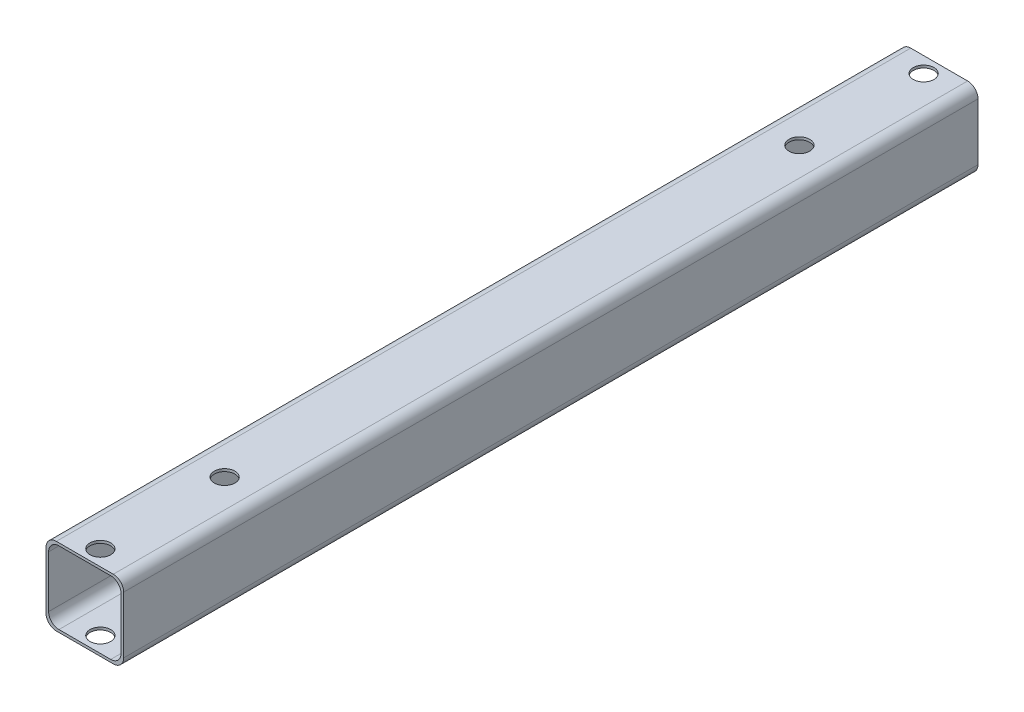
ISO-10303-21;
HEADER;
FILE_DESCRIPTION(('STEP AP214'),'2;1');
FILE_NAME('part.step','',(''),(''),'','','');
FILE_SCHEMA(('AUTOMOTIVE_DESIGN { 1 0 10303 214 1 1 1 1 }'));
ENDSEC;
DATA;
#1=APPLICATION_CONTEXT('core data for automotive mechanical design processes');
#2=APPLICATION_PROTOCOL_DEFINITION('international standard','automotive_design',2000,#1);
#3=PRODUCT_CONTEXT('',#1,'mechanical');
#4=PRODUCT('Part','Part','',(#3));
#5=PRODUCT_RELATED_PRODUCT_CATEGORY('part','',(#4));
#6=PRODUCT_DEFINITION_FORMATION('','',#4);
#7=PRODUCT_DEFINITION_CONTEXT('part definition',#1,'design');
#8=PRODUCT_DEFINITION('design','',#6,#7);
#9=PRODUCT_DEFINITION_SHAPE('','',#8);
#10=(LENGTH_UNIT() NAMED_UNIT(*) SI_UNIT(.MILLI.,.METRE.));
#11=(NAMED_UNIT(*) PLANE_ANGLE_UNIT() SI_UNIT($,.RADIAN.));
#12=(NAMED_UNIT(*) SI_UNIT($,.STERADIAN.) SOLID_ANGLE_UNIT());
#13=UNCERTAINTY_MEASURE_WITH_UNIT(LENGTH_MEASURE(1.E-05),#10,'distance_accuracy_value','');
#14=(GEOMETRIC_REPRESENTATION_CONTEXT(3) GLOBAL_UNCERTAINTY_ASSIGNED_CONTEXT((#13)) GLOBAL_UNIT_ASSIGNED_CONTEXT((#10,
#11,#12)) REPRESENTATION_CONTEXT('',''));
#15=CARTESIAN_POINT('',(0.,0.,0.));
#16=DIRECTION('',(0.,0.,1.));
#17=DIRECTION('',(1.,0.,0.));
#18=AXIS2_PLACEMENT_3D('',#15,#16,#17);
#19=CARTESIAN_POINT('',(0.,0.,165.));
#20=DIRECTION('',(0.,0.,1.));
#21=DIRECTION('',(1.,0.,0.));
#22=AXIS2_PLACEMENT_3D('',#19,#20,#21);
#23=PLANE('',#22);
#24=DIRECTION('',(0.,-1.,0.));
#25=VECTOR('',#24,1.);
#26=CARTESIAN_POINT('',(-7.5,-7.5,165.));
#27=LINE('',#26,#25);
#28=CARTESIAN_POINT('',(-7.5,5.5,165.));
#29=VERTEX_POINT('',#28);
#30=CARTESIAN_POINT('',(-7.5,-5.5,165.));
#31=VERTEX_POINT('',#30);
#32=EDGE_CURVE('E306',#29,#31,#27,.T.);
#33=ORIENTED_EDGE('',*,*,#32,.T.);
#34=CARTESIAN_POINT('',(-5.5,-5.5,165.));
#35=DIRECTION('',(0.,0.,1.));
#36=DIRECTION('',(1.,0.,0.));
#37=AXIS2_PLACEMENT_3D('',#34,#35,#36);
#38=CIRCLE('',#37,2.);
#39=CARTESIAN_POINT('',(-5.5,-7.5,165.));
#40=VERTEX_POINT('',#39);
#41=EDGE_CURVE('E11',#31,#40,#38,.T.);
#42=ORIENTED_EDGE('',*,*,#41,.T.);
#43=DIRECTION('',(1.,0.,0.));
#44=VECTOR('',#43,1.);
#45=CARTESIAN_POINT('',(7.5,-7.5,165.));
#46=LINE('',#45,#44);
#47=CARTESIAN_POINT('',(5.5,-7.5,165.));
#48=VERTEX_POINT('',#47);
#49=EDGE_CURVE('E309',#40,#48,#46,.T.);
#50=ORIENTED_EDGE('',*,*,#49,.T.);
#51=CARTESIAN_POINT('',(5.5,-5.5,165.));
#52=DIRECTION('',(0.,0.,1.));
#53=DIRECTION('',(1.,0.,0.));
#54=AXIS2_PLACEMENT_3D('',#51,#52,#53);
#55=CIRCLE('',#54,2.);
#56=CARTESIAN_POINT('',(7.5,-5.5,165.));
#57=VERTEX_POINT('',#56);
#58=EDGE_CURVE('E46',#48,#57,#55,.T.);
#59=ORIENTED_EDGE('',*,*,#58,.T.);
#60=DIRECTION('',(0.,1.,0.));
#61=VECTOR('',#60,1.);
#62=CARTESIAN_POINT('',(7.5,-7.5,165.));
#63=LINE('',#62,#61);
#64=CARTESIAN_POINT('',(7.5,5.5,165.));
#65=VERTEX_POINT('',#64);
#66=EDGE_CURVE('E183',#57,#65,#63,.T.);
#67=ORIENTED_EDGE('',*,*,#66,.T.);
#68=CARTESIAN_POINT('',(5.5,5.5,165.));
#69=DIRECTION('',(0.,0.,1.));
#70=DIRECTION('',(1.,0.,0.));
#71=AXIS2_PLACEMENT_3D('',#68,#69,#70);
#72=CIRCLE('',#71,2.);
#73=CARTESIAN_POINT('',(5.5,7.5,165.));
#74=VERTEX_POINT('',#73);
#75=EDGE_CURVE('E61',#65,#74,#72,.T.);
#76=ORIENTED_EDGE('',*,*,#75,.T.);
#77=DIRECTION('',(-1.,0.,0.));
#78=VECTOR('',#77,1.);
#79=CARTESIAN_POINT('',(7.5,7.5,165.));
#80=LINE('',#79,#78);
#81=CARTESIAN_POINT('',(-5.5,7.5,165.));
#82=VERTEX_POINT('',#81);
#83=EDGE_CURVE('E179',#74,#82,#80,.T.);
#84=ORIENTED_EDGE('',*,*,#83,.T.);
#85=CARTESIAN_POINT('',(-5.5,5.5,165.));
#86=DIRECTION('',(0.,0.,1.));
#87=DIRECTION('',(1.,0.,0.));
#88=AXIS2_PLACEMENT_3D('',#85,#86,#87);
#89=CIRCLE('',#88,2.);
#90=EDGE_CURVE('E241',#82,#29,#89,.T.);
#91=ORIENTED_EDGE('',*,*,#90,.T.);
#92=EDGE_LOOP('',(#33,#42,#50,#59,#67,#76,#84,#91));
#93=FACE_BOUND('',#92,.T.);
#94=DIRECTION('',(1.,0.,0.));
#95=VECTOR('',#94,1.);
#96=CARTESIAN_POINT('',(7.,-7.,165.));
#97=LINE('',#96,#95);
#98=CARTESIAN_POINT('',(-5.,-7.,165.));
#99=VERTEX_POINT('',#98);
#100=CARTESIAN_POINT('',(5.,-7.,165.));
#101=VERTEX_POINT('',#100);
#102=EDGE_CURVE('E292',#99,#101,#97,.T.);
#103=ORIENTED_EDGE('',*,*,#102,.F.);
#104=CARTESIAN_POINT('',(-5.,-5.,165.));
#105=DIRECTION('',(0.,0.,1.));
#106=DIRECTION('',(1.,0.,0.));
#107=AXIS2_PLACEMENT_3D('',#104,#105,#106);
#108=CIRCLE('',#107,2.);
#109=CARTESIAN_POINT('',(-7.,-5.,165.));
#110=VERTEX_POINT('',#109);
#111=EDGE_CURVE('E164',#99,#110,#108,.F.);
#112=ORIENTED_EDGE('',*,*,#111,.T.);
#113=DIRECTION('',(0.,-1.,0.));
#114=VECTOR('',#113,1.);
#115=CARTESIAN_POINT('',(-7.,-7.,165.));
#116=LINE('',#115,#114);
#117=CARTESIAN_POINT('',(-7.,5.,165.));
#118=VERTEX_POINT('',#117);
#119=EDGE_CURVE('E289',#118,#110,#116,.T.);
#120=ORIENTED_EDGE('',*,*,#119,.F.);
#121=CARTESIAN_POINT('',(-5.,5.,165.));
#122=DIRECTION('',(0.,0.,1.));
#123=DIRECTION('',(1.,0.,0.));
#124=AXIS2_PLACEMENT_3D('',#121,#122,#123);
#125=CIRCLE('',#124,2.);
#126=CARTESIAN_POINT('',(-5.,7.,165.));
#127=VERTEX_POINT('',#126);
#128=EDGE_CURVE('E231',#118,#127,#125,.F.);
#129=ORIENTED_EDGE('',*,*,#128,.T.);
#130=DIRECTION('',(-1.,0.,0.));
#131=VECTOR('',#130,1.);
#132=CARTESIAN_POINT('',(7.,7.,165.));
#133=LINE('',#132,#131);
#134=CARTESIAN_POINT('',(5.,7.,165.));
#135=VERTEX_POINT('',#134);
#136=EDGE_CURVE('E298',#135,#127,#133,.T.);
#137=ORIENTED_EDGE('',*,*,#136,.F.);
#138=CARTESIAN_POINT('',(5.,5.,165.));
#139=DIRECTION('',(0.,0.,1.));
#140=DIRECTION('',(1.,0.,0.));
#141=AXIS2_PLACEMENT_3D('',#138,#139,#140);
#142=CIRCLE('',#141,2.);
#143=CARTESIAN_POINT('',(7.,5.,165.));
#144=VERTEX_POINT('',#143);
#145=EDGE_CURVE('E165',#135,#144,#142,.F.);
#146=ORIENTED_EDGE('',*,*,#145,.T.);
#147=DIRECTION('',(0.,1.,0.));
#148=VECTOR('',#147,1.);
#149=CARTESIAN_POINT('',(7.,-7.,165.));
#150=LINE('',#149,#148);
#151=CARTESIAN_POINT('',(7.,-5.,165.));
#152=VERTEX_POINT('',#151);
#153=EDGE_CURVE('E295',#152,#144,#150,.T.);
#154=ORIENTED_EDGE('',*,*,#153,.F.);
#155=CARTESIAN_POINT('',(5.,-5.,165.));
#156=DIRECTION('',(0.,0.,1.));
#157=DIRECTION('',(1.,0.,0.));
#158=AXIS2_PLACEMENT_3D('',#155,#156,#157);
#159=CIRCLE('',#158,2.);
#160=EDGE_CURVE('E223',#152,#101,#159,.F.);
#161=ORIENTED_EDGE('',*,*,#160,.T.);
#162=EDGE_LOOP('',(#103,#112,#120,#129,#137,#146,#154,#161));
#163=FACE_BOUND('',#162,.T.);
#164=ADVANCED_FACE('F37',(#93,#163),#23,.T.);
#165=CARTESIAN_POINT('',(0.,0.,0.));
#166=DIRECTION('',(0.,0.,1.));
#167=DIRECTION('',(1.,0.,0.));
#168=AXIS2_PLACEMENT_3D('',#165,#166,#167);
#169=PLANE('',#168);
#170=DIRECTION('',(1.,0.,0.));
#171=VECTOR('',#170,1.);
#172=CARTESIAN_POINT('',(7.5,-7.5,0.));
#173=LINE('',#172,#171);
#174=CARTESIAN_POINT('',(-5.5,-7.5,0.));
#175=VERTEX_POINT('',#174);
#176=CARTESIAN_POINT('',(5.5,-7.5,0.));
#177=VERTEX_POINT('',#176);
#178=EDGE_CURVE('E315',#175,#177,#173,.T.);
#179=ORIENTED_EDGE('',*,*,#178,.F.);
#180=CARTESIAN_POINT('',(-5.5,-5.5,0.));
#181=DIRECTION('',(0.,0.,1.));
#182=DIRECTION('',(1.,0.,0.));
#183=AXIS2_PLACEMENT_3D('',#180,#181,#182);
#184=CIRCLE('',#183,2.);
#185=CARTESIAN_POINT('',(-7.5,-5.5,0.));
#186=VERTEX_POINT('',#185);
#187=EDGE_CURVE('E239',#175,#186,#184,.F.);
#188=ORIENTED_EDGE('',*,*,#187,.T.);
#189=DIRECTION('',(0.,-1.,0.));
#190=VECTOR('',#189,1.);
#191=CARTESIAN_POINT('',(-7.5,-7.5,0.));
#192=LINE('',#191,#190);
#193=CARTESIAN_POINT('',(-7.5,5.5,0.));
#194=VERTEX_POINT('',#193);
#195=EDGE_CURVE('E301',#194,#186,#192,.T.);
#196=ORIENTED_EDGE('',*,*,#195,.F.);
#197=CARTESIAN_POINT('',(-5.5,5.5,0.));
#198=DIRECTION('',(0.,0.,1.));
#199=DIRECTION('',(1.,0.,0.));
#200=AXIS2_PLACEMENT_3D('',#197,#198,#199);
#201=CIRCLE('',#200,2.);
#202=CARTESIAN_POINT('',(-5.5,7.5,0.));
#203=VERTEX_POINT('',#202);
#204=EDGE_CURVE('E233',#194,#203,#201,.F.);
#205=ORIENTED_EDGE('',*,*,#204,.T.);
#206=DIRECTION('',(-1.,0.,0.));
#207=VECTOR('',#206,1.);
#208=CARTESIAN_POINT('',(7.5,7.5,0.));
#209=LINE('',#208,#207);
#210=CARTESIAN_POINT('',(5.5,7.5,0.));
#211=VERTEX_POINT('',#210);
#212=EDGE_CURVE('E186',#211,#203,#209,.T.);
#213=ORIENTED_EDGE('',*,*,#212,.F.);
#214=CARTESIAN_POINT('',(5.5,5.5,0.));
#215=DIRECTION('',(0.,0.,1.));
#216=DIRECTION('',(1.,0.,0.));
#217=AXIS2_PLACEMENT_3D('',#214,#215,#216);
#218=CIRCLE('',#217,2.);
#219=CARTESIAN_POINT('',(7.5,5.5,0.));
#220=VERTEX_POINT('',#219);
#221=EDGE_CURVE('E235',#211,#220,#218,.F.);
#222=ORIENTED_EDGE('',*,*,#221,.T.);
#223=DIRECTION('',(0.,1.,0.));
#224=VECTOR('',#223,1.);
#225=CARTESIAN_POINT('',(7.5,-7.5,0.));
#226=LINE('',#225,#224);
#227=CARTESIAN_POINT('',(7.5,-5.5,0.));
#228=VERTEX_POINT('',#227);
#229=EDGE_CURVE('E317',#228,#220,#226,.T.);
#230=ORIENTED_EDGE('',*,*,#229,.F.);
#231=CARTESIAN_POINT('',(5.5,-5.5,0.));
#232=DIRECTION('',(0.,0.,1.));
#233=DIRECTION('',(1.,0.,0.));
#234=AXIS2_PLACEMENT_3D('',#231,#232,#233);
#235=CIRCLE('',#234,2.);
#236=EDGE_CURVE('E237',#228,#177,#235,.F.);
#237=ORIENTED_EDGE('',*,*,#236,.T.);
#238=EDGE_LOOP('',(#179,#188,#196,#205,#213,#222,#230,#237));
#239=FACE_BOUND('',#238,.T.);
#240=DIRECTION('',(-1.,0.,0.));
#241=VECTOR('',#240,1.);
#242=CARTESIAN_POINT('',(7.,7.,0.));
#243=LINE('',#242,#241);
#244=CARTESIAN_POINT('',(5.,7.,0.));
#245=VERTEX_POINT('',#244);
#246=CARTESIAN_POINT('',(-5.,7.,0.));
#247=VERTEX_POINT('',#246);
#248=EDGE_CURVE('E293',#245,#247,#243,.T.);
#249=ORIENTED_EDGE('',*,*,#248,.T.);
#250=CARTESIAN_POINT('',(-5.,5.,0.));
#251=DIRECTION('',(0.,0.,1.));
#252=DIRECTION('',(1.,0.,0.));
#253=AXIS2_PLACEMENT_3D('',#250,#251,#252);
#254=CIRCLE('',#253,2.);
#255=CARTESIAN_POINT('',(-7.,5.,0.));
#256=VERTEX_POINT('',#255);
#257=EDGE_CURVE('E229',#247,#256,#254,.T.);
#258=ORIENTED_EDGE('',*,*,#257,.T.);
#259=DIRECTION('',(0.,-1.,0.));
#260=VECTOR('',#259,1.);
#261=CARTESIAN_POINT('',(-7.,-7.,0.));
#262=LINE('',#261,#260);
#263=CARTESIAN_POINT('',(-7.,-5.,0.));
#264=VERTEX_POINT('',#263);
#265=EDGE_CURVE('E159',#256,#264,#262,.T.);
#266=ORIENTED_EDGE('',*,*,#265,.T.);
#267=CARTESIAN_POINT('',(-5.,-5.,0.));
#268=DIRECTION('',(0.,0.,1.));
#269=DIRECTION('',(1.,0.,0.));
#270=AXIS2_PLACEMENT_3D('',#267,#268,#269);
#271=CIRCLE('',#270,2.);
#272=CARTESIAN_POINT('',(-5.,-7.,0.));
#273=VERTEX_POINT('',#272);
#274=EDGE_CURVE('E153',#264,#273,#271,.T.);
#275=ORIENTED_EDGE('',*,*,#274,.T.);
#276=DIRECTION('',(1.,0.,0.));
#277=VECTOR('',#276,1.);
#278=CARTESIAN_POINT('',(7.,-7.,0.));
#279=LINE('',#278,#277);
#280=CARTESIAN_POINT('',(5.,-7.,0.));
#281=VERTEX_POINT('',#280);
#282=EDGE_CURVE('E157',#273,#281,#279,.T.);
#283=ORIENTED_EDGE('',*,*,#282,.T.);
#284=CARTESIAN_POINT('',(5.,-5.,0.));
#285=DIRECTION('',(0.,0.,1.));
#286=DIRECTION('',(1.,0.,0.));
#287=AXIS2_PLACEMENT_3D('',#284,#285,#286);
#288=CIRCLE('',#287,2.);
#289=CARTESIAN_POINT('',(7.,-5.,0.));
#290=VERTEX_POINT('',#289);
#291=EDGE_CURVE('E221',#281,#290,#288,.T.);
#292=ORIENTED_EDGE('',*,*,#291,.T.);
#293=DIRECTION('',(0.,1.,0.));
#294=VECTOR('',#293,1.);
#295=CARTESIAN_POINT('',(7.,-7.,0.));
#296=LINE('',#295,#294);
#297=CARTESIAN_POINT('',(7.,5.,0.));
#298=VERTEX_POINT('',#297);
#299=EDGE_CURVE('E175',#290,#298,#296,.T.);
#300=ORIENTED_EDGE('',*,*,#299,.T.);
#301=CARTESIAN_POINT('',(5.,5.,0.));
#302=DIRECTION('',(0.,0.,1.));
#303=DIRECTION('',(1.,0.,0.));
#304=AXIS2_PLACEMENT_3D('',#301,#302,#303);
#305=CIRCLE('',#304,2.);
#306=EDGE_CURVE('E225',#298,#245,#305,.T.);
#307=ORIENTED_EDGE('',*,*,#306,.T.);
#308=EDGE_LOOP('',(#249,#258,#266,#275,#283,#292,#300,#307));
#309=FACE_BOUND('',#308,.T.);
#310=ADVANCED_FACE('F156',(#239,#309),#169,.F.);
#311=CARTESIAN_POINT('',(-7.5,-7.5,165.));
#312=DIRECTION('',(1.,0.,0.));
#313=DIRECTION('',(0.,0.,-1.));
#314=AXIS2_PLACEMENT_3D('',#311,#312,#313);
#315=PLANE('',#314);
#316=ORIENTED_EDGE('',*,*,#195,.T.);
#317=DIRECTION('',(0.,0.,-1.));
#318=VECTOR('',#317,1.);
#319=CARTESIAN_POINT('',(-7.5,-5.5,165.));
#320=LINE('',#319,#318);
#321=EDGE_CURVE('E210',#186,#31,#320,.F.);
#322=ORIENTED_EDGE('',*,*,#321,.T.);
#323=ORIENTED_EDGE('',*,*,#32,.F.);
#324=DIRECTION('',(0.,0.,-1.));
#325=VECTOR('',#324,1.);
#326=CARTESIAN_POINT('',(-7.5,5.5,165.));
#327=LINE('',#326,#325);
#328=EDGE_CURVE('E207',#29,#194,#327,.T.);
#329=ORIENTED_EDGE('',*,*,#328,.T.);
#330=EDGE_LOOP('',(#316,#322,#323,#329));
#331=FACE_BOUND('',#330,.T.);
#332=ADVANCED_FACE('F333',(#331),#315,.F.);
#333=CARTESIAN_POINT('',(7.5,-7.5,165.));
#334=DIRECTION('',(0.,1.,0.));
#335=DIRECTION('',(-1.,0.,0.));
#336=AXIS2_PLACEMENT_3D('',#333,#334,#335);
#337=PLANE('',#336);
#338=CARTESIAN_POINT('',(0.,-7.5,3.));
#339=DIRECTION('',(0.,-1.,0.));
#340=DIRECTION('',(1.,0.,0.));
#341=AXIS2_PLACEMENT_3D('',#338,#339,#340);
#342=CIRCLE('',#341,2.);
#343=CARTESIAN_POINT('',(2.,-7.5,3.));
#344=VERTEX_POINT('',#343);
#345=EDGE_CURVE('E604',#344,#344,#342,.T.);
#346=ORIENTED_EDGE('',*,*,#345,.F.);
#347=EDGE_LOOP('',(#346));
#348=FACE_BOUND('',#347,.T.);
#349=CARTESIAN_POINT('',(0.,-7.5,27.));
#350=DIRECTION('',(0.,-1.,0.));
#351=DIRECTION('',(1.,0.,0.));
#352=AXIS2_PLACEMENT_3D('',#349,#350,#351);
#353=CIRCLE('',#352,2.);
#354=CARTESIAN_POINT('',(2.,-7.5,27.));
#355=VERTEX_POINT('',#354);
#356=EDGE_CURVE('E257',#355,#355,#353,.T.);
#357=ORIENTED_EDGE('',*,*,#356,.F.);
#358=EDGE_LOOP('',(#357));
#359=FACE_BOUND('',#358,.T.);
#360=CARTESIAN_POINT('',(0.,-7.5,138.));
#361=DIRECTION('',(0.,-1.,0.));
#362=DIRECTION('',(1.,0.,0.));
#363=AXIS2_PLACEMENT_3D('',#360,#361,#362);
#364=CIRCLE('',#363,2.);
#365=CARTESIAN_POINT('',(2.,-7.5,138.));
#366=VERTEX_POINT('',#365);
#367=EDGE_CURVE('E253',#366,#366,#364,.T.);
#368=ORIENTED_EDGE('',*,*,#367,.F.);
#369=EDGE_LOOP('',(#368));
#370=FACE_BOUND('',#369,.T.);
#371=CARTESIAN_POINT('',(0.,-7.5,162.));
#372=DIRECTION('',(0.,-1.,0.));
#373=DIRECTION('',(1.,0.,0.));
#374=AXIS2_PLACEMENT_3D('',#371,#372,#373);
#375=CIRCLE('',#374,2.);
#376=CARTESIAN_POINT('',(2.,-7.5,162.));
#377=VERTEX_POINT('',#376);
#378=EDGE_CURVE('E249',#377,#377,#375,.T.);
#379=ORIENTED_EDGE('',*,*,#378,.F.);
#380=EDGE_LOOP('',(#379));
#381=FACE_BOUND('',#380,.T.);
#382=ORIENTED_EDGE('',*,*,#49,.F.);
#383=DIRECTION('',(0.,0.,-1.));
#384=VECTOR('',#383,1.);
#385=CARTESIAN_POINT('',(-5.5,-7.5,165.));
#386=LINE('',#385,#384);
#387=EDGE_CURVE('E204',#40,#175,#386,.T.);
#388=ORIENTED_EDGE('',*,*,#387,.T.);
#389=ORIENTED_EDGE('',*,*,#178,.T.);
#390=DIRECTION('',(0.,0.,-1.));
#391=VECTOR('',#390,1.);
#392=CARTESIAN_POINT('',(5.5,-7.5,165.));
#393=LINE('',#392,#391);
#394=EDGE_CURVE('E202',#177,#48,#393,.F.);
#395=ORIENTED_EDGE('',*,*,#394,.T.);
#396=EDGE_LOOP('',(#382,#388,#389,#395));
#397=FACE_BOUND('',#396,.T.);
#398=ADVANCED_FACE('F342',(#348,#359,#370,#381,#397),#337,.F.);
#399=CARTESIAN_POINT('',(7.5,-7.5,165.));
#400=DIRECTION('',(-1.,0.,0.));
#401=DIRECTION('',(0.,0.,1.));
#402=AXIS2_PLACEMENT_3D('',#399,#400,#401);
#403=PLANE('',#402);
#404=ORIENTED_EDGE('',*,*,#66,.F.);
#405=DIRECTION('',(0.,0.,-1.));
#406=VECTOR('',#405,1.);
#407=CARTESIAN_POINT('',(7.5,-5.5,165.));
#408=LINE('',#407,#406);
#409=EDGE_CURVE('E214',#57,#228,#408,.T.);
#410=ORIENTED_EDGE('',*,*,#409,.T.);
#411=ORIENTED_EDGE('',*,*,#229,.T.);
#412=DIRECTION('',(0.,0.,-1.));
#413=VECTOR('',#412,1.);
#414=CARTESIAN_POINT('',(7.5,5.5,165.));
#415=LINE('',#414,#413);
#416=EDGE_CURVE('E212',#220,#65,#415,.F.);
#417=ORIENTED_EDGE('',*,*,#416,.T.);
#418=EDGE_LOOP('',(#404,#410,#411,#417));
#419=FACE_BOUND('',#418,.T.);
#420=ADVANCED_FACE('F349',(#419),#403,.F.);
#421=CARTESIAN_POINT('',(7.5,7.5,165.));
#422=DIRECTION('',(0.,-1.,0.));
#423=DIRECTION('',(1.,0.,0.));
#424=AXIS2_PLACEMENT_3D('',#421,#422,#423);
#425=PLANE('',#424);
#426=CARTESIAN_POINT('',(0.,7.5,3.));
#427=DIRECTION('',(0.,-1.,0.));
#428=DIRECTION('',(1.,0.,0.));
#429=AXIS2_PLACEMENT_3D('',#426,#427,#428);
#430=CIRCLE('',#429,2.);
#431=CARTESIAN_POINT('',(2.,7.5,3.));
#432=VERTEX_POINT('',#431);
#433=EDGE_CURVE('E264',#432,#432,#430,.T.);
#434=ORIENTED_EDGE('',*,*,#433,.T.);
#435=EDGE_LOOP('',(#434));
#436=FACE_BOUND('',#435,.T.);
#437=CARTESIAN_POINT('',(0.,7.5,27.));
#438=DIRECTION('',(0.,-1.,0.));
#439=DIRECTION('',(1.,0.,0.));
#440=AXIS2_PLACEMENT_3D('',#437,#438,#439);
#441=CIRCLE('',#440,2.);
#442=CARTESIAN_POINT('',(2.,7.5,27.));
#443=VERTEX_POINT('',#442);
#444=EDGE_CURVE('E261',#443,#443,#441,.T.);
#445=ORIENTED_EDGE('',*,*,#444,.T.);
#446=EDGE_LOOP('',(#445));
#447=FACE_BOUND('',#446,.T.);
#448=CARTESIAN_POINT('',(0.,7.5,138.));
#449=DIRECTION('',(0.,-1.,0.));
#450=DIRECTION('',(1.,0.,0.));
#451=AXIS2_PLACEMENT_3D('',#448,#449,#450);
#452=CIRCLE('',#451,2.);
#453=CARTESIAN_POINT('',(2.,7.5,138.));
#454=VERTEX_POINT('',#453);
#455=EDGE_CURVE('E279',#454,#454,#452,.T.);
#456=ORIENTED_EDGE('',*,*,#455,.T.);
#457=EDGE_LOOP('',(#456));
#458=FACE_BOUND('',#457,.T.);
#459=CARTESIAN_POINT('',(0.,7.5,162.));
#460=DIRECTION('',(0.,-1.,0.));
#461=DIRECTION('',(1.,0.,0.));
#462=AXIS2_PLACEMENT_3D('',#459,#460,#461);
#463=CIRCLE('',#462,2.);
#464=CARTESIAN_POINT('',(2.,7.5,162.));
#465=VERTEX_POINT('',#464);
#466=EDGE_CURVE('E286',#465,#465,#463,.T.);
#467=ORIENTED_EDGE('',*,*,#466,.T.);
#468=EDGE_LOOP('',(#467));
#469=FACE_BOUND('',#468,.T.);
#470=ORIENTED_EDGE('',*,*,#83,.F.);
#471=DIRECTION('',(0.,0.,-1.));
#472=VECTOR('',#471,1.);
#473=CARTESIAN_POINT('',(5.5,7.5,165.));
#474=LINE('',#473,#472);
#475=EDGE_CURVE('E218',#74,#211,#474,.T.);
#476=ORIENTED_EDGE('',*,*,#475,.T.);
#477=ORIENTED_EDGE('',*,*,#212,.T.);
#478=DIRECTION('',(0.,0.,-1.));
#479=VECTOR('',#478,1.);
#480=CARTESIAN_POINT('',(-5.5,7.5,165.));
#481=LINE('',#480,#479);
#482=EDGE_CURVE('E54',#203,#82,#481,.F.);
#483=ORIENTED_EDGE('',*,*,#482,.T.);
#484=EDGE_LOOP('',(#470,#476,#477,#483));
#485=FACE_BOUND('',#484,.T.);
#486=ADVANCED_FACE('F323',(#436,#447,#458,#469,#485),#425,.F.);
#487=CARTESIAN_POINT('',(-7.,-7.,165.));
#488=DIRECTION('',(1.,0.,0.));
#489=DIRECTION('',(0.,0.,-1.));
#490=AXIS2_PLACEMENT_3D('',#487,#488,#489);
#491=PLANE('',#490);
#492=ORIENTED_EDGE('',*,*,#119,.T.);
#493=DIRECTION('',(0.,0.,-1.));
#494=VECTOR('',#493,1.);
#495=CARTESIAN_POINT('',(-7.,-5.,0.));
#496=LINE('',#495,#494);
#497=EDGE_CURVE('E200',#110,#264,#496,.T.);
#498=ORIENTED_EDGE('',*,*,#497,.T.);
#499=ORIENTED_EDGE('',*,*,#265,.F.);
#500=DIRECTION('',(0.,0.,-1.));
#501=VECTOR('',#500,1.);
#502=CARTESIAN_POINT('',(-7.,5.,165.));
#503=LINE('',#502,#501);
#504=EDGE_CURVE('E198',#256,#118,#503,.F.);
#505=ORIENTED_EDGE('',*,*,#504,.T.);
#506=EDGE_LOOP('',(#492,#498,#499,#505));
#507=FACE_BOUND('',#506,.T.);
#508=ADVANCED_FACE('F364',(#507),#491,.T.);
#509=CARTESIAN_POINT('',(7.,-7.,165.));
#510=DIRECTION('',(0.,1.,0.));
#511=DIRECTION('',(-1.,0.,0.));
#512=AXIS2_PLACEMENT_3D('',#509,#510,#511);
#513=PLANE('',#512);
#514=CARTESIAN_POINT('',(0.,-7.,3.));
#515=DIRECTION('',(0.,1.,0.));
#516=DIRECTION('',(-1.,0.,0.));
#517=AXIS2_PLACEMENT_3D('',#514,#515,#516);
#518=CIRCLE('',#517,2.);
#519=CARTESIAN_POINT('',(-2.,-7.,3.));
#520=VERTEX_POINT('',#519);
#521=EDGE_CURVE('E269',#520,#520,#518,.T.);
#522=ORIENTED_EDGE('',*,*,#521,.F.);
#523=EDGE_LOOP('',(#522));
#524=FACE_BOUND('',#523,.T.);
#525=CARTESIAN_POINT('',(0.,-7.,27.));
#526=DIRECTION('',(0.,1.,0.));
#527=DIRECTION('',(-1.,0.,0.));
#528=AXIS2_PLACEMENT_3D('',#525,#526,#527);
#529=CIRCLE('',#528,2.);
#530=CARTESIAN_POINT('',(-2.,-7.,27.));
#531=VERTEX_POINT('',#530);
#532=EDGE_CURVE('E256',#531,#531,#529,.T.);
#533=ORIENTED_EDGE('',*,*,#532,.F.);
#534=EDGE_LOOP('',(#533));
#535=FACE_BOUND('',#534,.T.);
#536=CARTESIAN_POINT('',(0.,-7.,138.));
#537=DIRECTION('',(0.,1.,0.));
#538=DIRECTION('',(-1.,0.,0.));
#539=AXIS2_PLACEMENT_3D('',#536,#537,#538);
#540=CIRCLE('',#539,2.);
#541=CARTESIAN_POINT('',(-2.,-7.,138.));
#542=VERTEX_POINT('',#541);
#543=EDGE_CURVE('E252',#542,#542,#540,.T.);
#544=ORIENTED_EDGE('',*,*,#543,.F.);
#545=EDGE_LOOP('',(#544));
#546=FACE_BOUND('',#545,.T.);
#547=CARTESIAN_POINT('',(0.,-7.,162.));
#548=DIRECTION('',(0.,1.,0.));
#549=DIRECTION('',(-1.,0.,0.));
#550=AXIS2_PLACEMENT_3D('',#547,#548,#549);
#551=CIRCLE('',#550,2.);
#552=CARTESIAN_POINT('',(-2.,-7.,162.));
#553=VERTEX_POINT('',#552);
#554=EDGE_CURVE('E248',#553,#553,#551,.T.);
#555=ORIENTED_EDGE('',*,*,#554,.F.);
#556=EDGE_LOOP('',(#555));
#557=FACE_BOUND('',#556,.T.);
#558=ORIENTED_EDGE('',*,*,#102,.T.);
#559=DIRECTION('',(0.,0.,-1.));
#560=VECTOR('',#559,1.);
#561=CARTESIAN_POINT('',(5.,-7.,0.));
#562=LINE('',#561,#560);
#563=EDGE_CURVE('E174',#101,#281,#562,.T.);
#564=ORIENTED_EDGE('',*,*,#563,.T.);
#565=ORIENTED_EDGE('',*,*,#282,.F.);
#566=DIRECTION('',(0.,0.,-1.));
#567=VECTOR('',#566,1.);
#568=CARTESIAN_POINT('',(-5.,-7.,165.));
#569=LINE('',#568,#567);
#570=EDGE_CURVE('E171',#273,#99,#569,.F.);
#571=ORIENTED_EDGE('',*,*,#570,.T.);
#572=EDGE_LOOP('',(#558,#564,#565,#571));
#573=FACE_BOUND('',#572,.T.);
#574=ADVANCED_FACE('F170',(#524,#535,#546,#557,#573),#513,.T.);
#575=CARTESIAN_POINT('',(7.,-7.,165.));
#576=DIRECTION('',(-1.,0.,0.));
#577=DIRECTION('',(0.,0.,1.));
#578=AXIS2_PLACEMENT_3D('',#575,#576,#577);
#579=PLANE('',#578);
#580=ORIENTED_EDGE('',*,*,#299,.F.);
#581=DIRECTION('',(0.,0.,-1.));
#582=VECTOR('',#581,1.);
#583=CARTESIAN_POINT('',(7.,-5.,165.));
#584=LINE('',#583,#582);
#585=EDGE_CURVE('E191',#290,#152,#584,.F.);
#586=ORIENTED_EDGE('',*,*,#585,.T.);
#587=ORIENTED_EDGE('',*,*,#153,.T.);
#588=DIRECTION('',(0.,0.,-1.));
#589=VECTOR('',#588,1.);
#590=CARTESIAN_POINT('',(7.,5.,0.));
#591=LINE('',#590,#589);
#592=EDGE_CURVE('E181',#144,#298,#591,.T.);
#593=ORIENTED_EDGE('',*,*,#592,.T.);
#594=EDGE_LOOP('',(#580,#586,#587,#593));
#595=FACE_BOUND('',#594,.T.);
#596=ADVANCED_FACE('F411',(#595),#579,.T.);
#597=CARTESIAN_POINT('',(7.,7.,165.));
#598=DIRECTION('',(0.,-1.,0.));
#599=DIRECTION('',(1.,0.,0.));
#600=AXIS2_PLACEMENT_3D('',#597,#598,#599);
#601=PLANE('',#600);
#602=CARTESIAN_POINT('',(0.,7.,3.));
#603=DIRECTION('',(0.,-1.,0.));
#604=DIRECTION('',(1.,0.,0.));
#605=AXIS2_PLACEMENT_3D('',#602,#603,#604);
#606=CIRCLE('',#605,2.);
#607=CARTESIAN_POINT('',(2.,7.,3.));
#608=VERTEX_POINT('',#607);
#609=EDGE_CURVE('E41',#608,#608,#606,.T.);
#610=ORIENTED_EDGE('',*,*,#609,.F.);
#611=EDGE_LOOP('',(#610));
#612=FACE_BOUND('',#611,.T.);
#613=CARTESIAN_POINT('',(0.,7.,27.));
#614=DIRECTION('',(0.,-1.,0.));
#615=DIRECTION('',(1.,0.,0.));
#616=AXIS2_PLACEMENT_3D('',#613,#614,#615);
#617=CIRCLE('',#616,2.);
#618=CARTESIAN_POINT('',(2.,7.,27.));
#619=VERTEX_POINT('',#618);
#620=EDGE_CURVE('E254',#619,#619,#617,.T.);
#621=ORIENTED_EDGE('',*,*,#620,.F.);
#622=EDGE_LOOP('',(#621));
#623=FACE_BOUND('',#622,.T.);
#624=CARTESIAN_POINT('',(0.,7.,138.));
#625=DIRECTION('',(0.,-1.,0.));
#626=DIRECTION('',(1.,0.,0.));
#627=AXIS2_PLACEMENT_3D('',#624,#625,#626);
#628=CIRCLE('',#627,2.);
#629=CARTESIAN_POINT('',(2.,7.,138.));
#630=VERTEX_POINT('',#629);
#631=EDGE_CURVE('E250',#630,#630,#628,.T.);
#632=ORIENTED_EDGE('',*,*,#631,.F.);
#633=EDGE_LOOP('',(#632));
#634=FACE_BOUND('',#633,.T.);
#635=CARTESIAN_POINT('',(0.,7.,162.));
#636=DIRECTION('',(0.,-1.,0.));
#637=DIRECTION('',(1.,0.,0.));
#638=AXIS2_PLACEMENT_3D('',#635,#636,#637);
#639=CIRCLE('',#638,2.);
#640=CARTESIAN_POINT('',(2.,7.,162.));
#641=VERTEX_POINT('',#640);
#642=EDGE_CURVE('E245',#641,#641,#639,.T.);
#643=ORIENTED_EDGE('',*,*,#642,.F.);
#644=EDGE_LOOP('',(#643));
#645=FACE_BOUND('',#644,.T.);
#646=ORIENTED_EDGE('',*,*,#248,.F.);
#647=DIRECTION('',(0.,0.,-1.));
#648=VECTOR('',#647,1.);
#649=CARTESIAN_POINT('',(5.,7.,165.));
#650=LINE('',#649,#648);
#651=EDGE_CURVE('E196',#245,#135,#650,.F.);
#652=ORIENTED_EDGE('',*,*,#651,.T.);
#653=ORIENTED_EDGE('',*,*,#136,.T.);
#654=DIRECTION('',(0.,0.,-1.));
#655=VECTOR('',#654,1.);
#656=CARTESIAN_POINT('',(-5.,7.,0.));
#657=LINE('',#656,#655);
#658=EDGE_CURVE('E193',#127,#247,#657,.T.);
#659=ORIENTED_EDGE('',*,*,#658,.T.);
#660=EDGE_LOOP('',(#646,#652,#653,#659));
#661=FACE_BOUND('',#660,.T.);
#662=ADVANCED_FACE('F375',(#612,#623,#634,#645,#661),#601,.T.);
#663=CARTESIAN_POINT('',(5.,-5.,165.));
#664=DIRECTION('',(0.,0.,1.));
#665=DIRECTION('',(1.,0.,0.));
#666=AXIS2_PLACEMENT_3D('',#663,#664,#665);
#667=CYLINDRICAL_SURFACE('',#666,2.);
#668=ORIENTED_EDGE('',*,*,#160,.F.);
#669=ORIENTED_EDGE('',*,*,#585,.F.);
#670=ORIENTED_EDGE('',*,*,#291,.F.);
#671=ORIENTED_EDGE('',*,*,#563,.F.);
#672=EDGE_LOOP('',(#668,#669,#670,#671));
#673=FACE_BOUND('',#672,.T.);
#674=ADVANCED_FACE('F371',(#673),#667,.F.);
#675=CARTESIAN_POINT('',(5.,5.,165.));
#676=DIRECTION('',(0.,0.,1.));
#677=DIRECTION('',(1.,0.,0.));
#678=AXIS2_PLACEMENT_3D('',#675,#676,#677);
#679=CYLINDRICAL_SURFACE('',#678,2.);
#680=ORIENTED_EDGE('',*,*,#145,.F.);
#681=ORIENTED_EDGE('',*,*,#651,.F.);
#682=ORIENTED_EDGE('',*,*,#306,.F.);
#683=ORIENTED_EDGE('',*,*,#592,.F.);
#684=EDGE_LOOP('',(#680,#681,#682,#683));
#685=FACE_BOUND('',#684,.T.);
#686=ADVANCED_FACE('F374',(#685),#679,.F.);
#687=CARTESIAN_POINT('',(-5.,-5.,165.));
#688=DIRECTION('',(0.,0.,1.));
#689=DIRECTION('',(1.,0.,0.));
#690=AXIS2_PLACEMENT_3D('',#687,#688,#689);
#691=CYLINDRICAL_SURFACE('',#690,2.);
#692=ORIENTED_EDGE('',*,*,#111,.F.);
#693=ORIENTED_EDGE('',*,*,#570,.F.);
#694=ORIENTED_EDGE('',*,*,#274,.F.);
#695=ORIENTED_EDGE('',*,*,#497,.F.);
#696=EDGE_LOOP('',(#692,#693,#694,#695));
#697=FACE_BOUND('',#696,.T.);
#698=ADVANCED_FACE('F178',(#697),#691,.F.);
#699=CARTESIAN_POINT('',(-5.,5.,165.));
#700=DIRECTION('',(0.,0.,1.));
#701=DIRECTION('',(1.,0.,0.));
#702=AXIS2_PLACEMENT_3D('',#699,#700,#701);
#703=CYLINDRICAL_SURFACE('',#702,2.);
#704=ORIENTED_EDGE('',*,*,#128,.F.);
#705=ORIENTED_EDGE('',*,*,#504,.F.);
#706=ORIENTED_EDGE('',*,*,#257,.F.);
#707=ORIENTED_EDGE('',*,*,#658,.F.);
#708=EDGE_LOOP('',(#704,#705,#706,#707));
#709=FACE_BOUND('',#708,.T.);
#710=ADVANCED_FACE('F382',(#709),#703,.F.);
#711=CARTESIAN_POINT('',(-5.5,-5.5,165.));
#712=DIRECTION('',(0.,0.,-1.));
#713=DIRECTION('',(-1.,0.,0.));
#714=AXIS2_PLACEMENT_3D('',#711,#712,#713);
#715=CYLINDRICAL_SURFACE('',#714,2.);
#716=ORIENTED_EDGE('',*,*,#41,.F.);
#717=ORIENTED_EDGE('',*,*,#321,.F.);
#718=ORIENTED_EDGE('',*,*,#187,.F.);
#719=ORIENTED_EDGE('',*,*,#387,.F.);
#720=EDGE_LOOP('',(#716,#717,#718,#719));
#721=FACE_BOUND('',#720,.T.);
#722=ADVANCED_FACE('F337',(#721),#715,.T.);
#723=CARTESIAN_POINT('',(5.5,-5.5,165.));
#724=DIRECTION('',(0.,0.,-1.));
#725=DIRECTION('',(-1.,0.,0.));
#726=AXIS2_PLACEMENT_3D('',#723,#724,#725);
#727=CYLINDRICAL_SURFACE('',#726,2.);
#728=ORIENTED_EDGE('',*,*,#58,.F.);
#729=ORIENTED_EDGE('',*,*,#394,.F.);
#730=ORIENTED_EDGE('',*,*,#236,.F.);
#731=ORIENTED_EDGE('',*,*,#409,.F.);
#732=EDGE_LOOP('',(#728,#729,#730,#731));
#733=FACE_BOUND('',#732,.T.);
#734=ADVANCED_FACE('F346',(#733),#727,.T.);
#735=CARTESIAN_POINT('',(5.5,5.5,165.));
#736=DIRECTION('',(0.,0.,-1.));
#737=DIRECTION('',(-1.,0.,0.));
#738=AXIS2_PLACEMENT_3D('',#735,#736,#737);
#739=CYLINDRICAL_SURFACE('',#738,2.);
#740=ORIENTED_EDGE('',*,*,#75,.F.);
#741=ORIENTED_EDGE('',*,*,#416,.F.);
#742=ORIENTED_EDGE('',*,*,#221,.F.);
#743=ORIENTED_EDGE('',*,*,#475,.F.);
#744=EDGE_LOOP('',(#740,#741,#742,#743));
#745=FACE_BOUND('',#744,.T.);
#746=ADVANCED_FACE('F351',(#745),#739,.T.);
#747=CARTESIAN_POINT('',(-5.5,5.5,165.));
#748=DIRECTION('',(0.,0.,-1.));
#749=DIRECTION('',(-1.,0.,0.));
#750=AXIS2_PLACEMENT_3D('',#747,#748,#749);
#751=CYLINDRICAL_SURFACE('',#750,2.);
#752=ORIENTED_EDGE('',*,*,#90,.F.);
#753=ORIENTED_EDGE('',*,*,#482,.F.);
#754=ORIENTED_EDGE('',*,*,#204,.F.);
#755=ORIENTED_EDGE('',*,*,#328,.F.);
#756=EDGE_LOOP('',(#752,#753,#754,#755));
#757=FACE_BOUND('',#756,.T.);
#758=ADVANCED_FACE('F39',(#757),#751,.T.);
#759=CARTESIAN_POINT('',(0.,20.5,162.));
#760=DIRECTION('',(0.,-1.,0.));
#761=DIRECTION('',(1.,0.,0.));
#762=AXIS2_PLACEMENT_3D('',#759,#760,#761);
#763=CYLINDRICAL_SURFACE('',#762,2.);
#764=ORIENTED_EDGE('',*,*,#642,.T.);
#765=EDGE_LOOP('',(#764));
#766=FACE_BOUND('',#765,.T.);
#767=ORIENTED_EDGE('',*,*,#466,.F.);
#768=EDGE_LOOP('',(#767));
#769=FACE_BOUND('',#768,.T.);
#770=ADVANCED_FACE('F393',(#766,#769),#763,.F.);
#771=ORIENTED_EDGE('',*,*,#554,.T.);
#772=EDGE_LOOP('',(#771));
#773=FACE_BOUND('',#772,.T.);
#774=ORIENTED_EDGE('',*,*,#378,.T.);
#775=EDGE_LOOP('',(#774));
#776=FACE_BOUND('',#775,.T.);
#777=ADVANCED_FACE('F397',(#773,#776),#763,.F.);
#778=CARTESIAN_POINT('',(0.,20.5,138.));
#779=DIRECTION('',(0.,-1.,0.));
#780=DIRECTION('',(1.,0.,0.));
#781=AXIS2_PLACEMENT_3D('',#778,#779,#780);
#782=CYLINDRICAL_SURFACE('',#781,2.);
#783=ORIENTED_EDGE('',*,*,#631,.T.);
#784=EDGE_LOOP('',(#783));
#785=FACE_BOUND('',#784,.T.);
#786=ORIENTED_EDGE('',*,*,#455,.F.);
#787=EDGE_LOOP('',(#786));
#788=FACE_BOUND('',#787,.T.);
#789=ADVANCED_FACE('F403',(#785,#788),#782,.F.);
#790=ORIENTED_EDGE('',*,*,#543,.T.);
#791=EDGE_LOOP('',(#790));
#792=FACE_BOUND('',#791,.T.);
#793=ORIENTED_EDGE('',*,*,#367,.T.);
#794=EDGE_LOOP('',(#793));
#795=FACE_BOUND('',#794,.T.);
#796=ADVANCED_FACE('F551',(#792,#795),#782,.F.);
#797=CARTESIAN_POINT('',(0.,20.5,27.));
#798=DIRECTION('',(0.,-1.,0.));
#799=DIRECTION('',(1.,0.,0.));
#800=AXIS2_PLACEMENT_3D('',#797,#798,#799);
#801=CYLINDRICAL_SURFACE('',#800,2.);
#802=ORIENTED_EDGE('',*,*,#620,.T.);
#803=EDGE_LOOP('',(#802));
#804=FACE_BOUND('',#803,.T.);
#805=ORIENTED_EDGE('',*,*,#444,.F.);
#806=EDGE_LOOP('',(#805));
#807=FACE_BOUND('',#806,.T.);
#808=ADVANCED_FACE('F559',(#804,#807),#801,.F.);
#809=ORIENTED_EDGE('',*,*,#532,.T.);
#810=EDGE_LOOP('',(#809));
#811=FACE_BOUND('',#810,.T.);
#812=ORIENTED_EDGE('',*,*,#356,.T.);
#813=EDGE_LOOP('',(#812));
#814=FACE_BOUND('',#813,.T.);
#815=ADVANCED_FACE('F567',(#811,#814),#801,.F.);
#816=CARTESIAN_POINT('',(0.,20.5,3.));
#817=DIRECTION('',(0.,-1.,0.));
#818=DIRECTION('',(1.,0.,0.));
#819=AXIS2_PLACEMENT_3D('',#816,#817,#818);
#820=CYLINDRICAL_SURFACE('',#819,2.);
#821=ORIENTED_EDGE('',*,*,#609,.T.);
#822=EDGE_LOOP('',(#821));
#823=FACE_BOUND('',#822,.T.);
#824=ORIENTED_EDGE('',*,*,#433,.F.);
#825=EDGE_LOOP('',(#824));
#826=FACE_BOUND('',#825,.T.);
#827=ADVANCED_FACE('F574',(#823,#826),#820,.F.);
#828=ORIENTED_EDGE('',*,*,#521,.T.);
#829=EDGE_LOOP('',(#828));
#830=FACE_BOUND('',#829,.T.);
#831=ORIENTED_EDGE('',*,*,#345,.T.);
#832=EDGE_LOOP('',(#831));
#833=FACE_BOUND('',#832,.T.);
#834=ADVANCED_FACE('F582',(#830,#833),#820,.F.);
#835=CLOSED_SHELL('',(#164,#310,#332,#398,#420,#486,#508,#574,#596,#662,#674,#686,#698,#710,
#722,#734,#746,#758,#770,#777,#789,#796,#808,#815,#827,#834));
#836=MANIFOLD_SOLID_BREP('B2',#835);
#837=ADVANCED_BREP_SHAPE_REPRESENTATION('',(#18,#836),#14);
#838=SHAPE_DEFINITION_REPRESENTATION(#9,#837);
ENDSEC;
END-ISO-10303-21;
